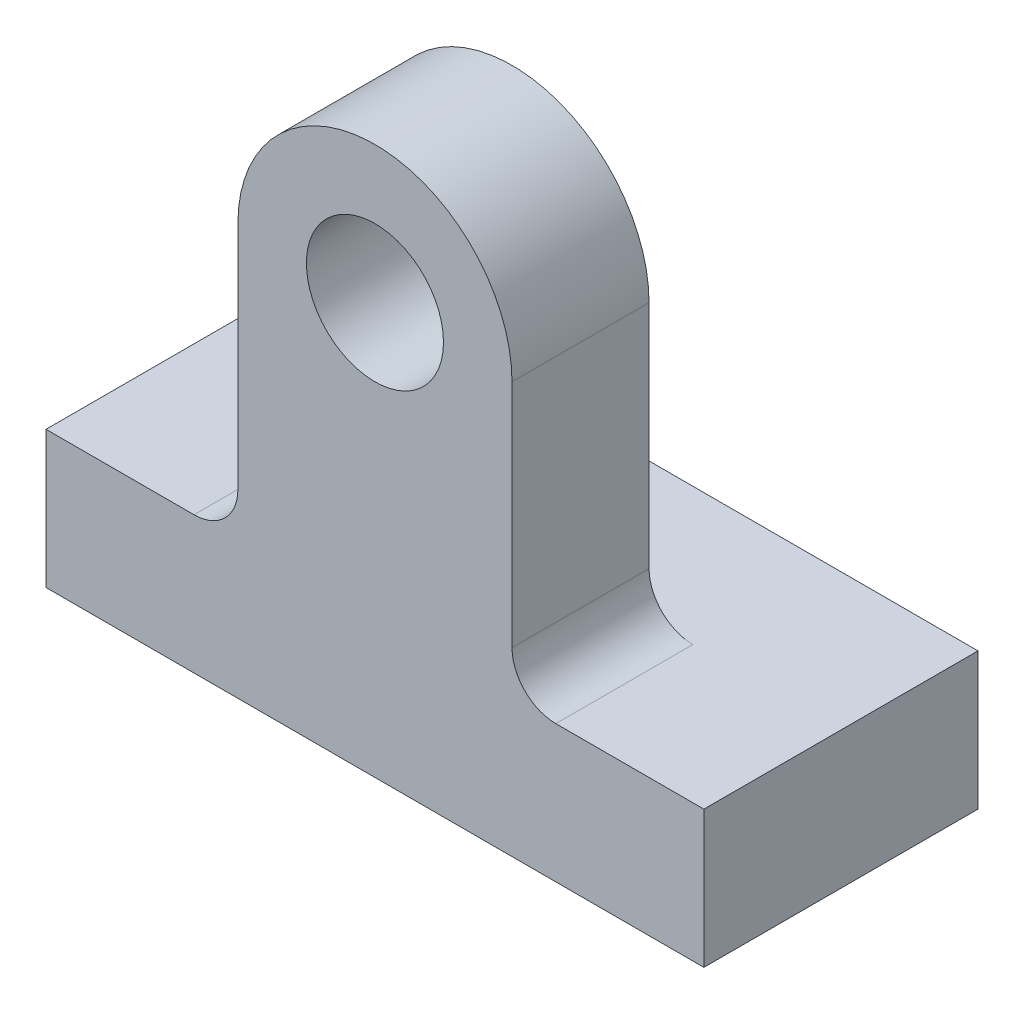
ISO-10303-21;
HEADER;
FILE_DESCRIPTION(('STEP AP214'),'2;1');
FILE_NAME('part.step','',(''),(''),'','','');
FILE_SCHEMA(('AUTOMOTIVE_DESIGN { 1 0 10303 214 1 1 1 1 }'));
ENDSEC;
DATA;
#1=APPLICATION_CONTEXT('core data for automotive mechanical design processes');
#2=APPLICATION_PROTOCOL_DEFINITION('international standard','automotive_design',2000,#1);
#3=PRODUCT_CONTEXT('',#1,'mechanical');
#4=PRODUCT('Part','Part','',(#3));
#5=PRODUCT_RELATED_PRODUCT_CATEGORY('part','',(#4));
#6=PRODUCT_DEFINITION_FORMATION('','',#4);
#7=PRODUCT_DEFINITION_CONTEXT('part definition',#1,'design');
#8=PRODUCT_DEFINITION('design','',#6,#7);
#9=PRODUCT_DEFINITION_SHAPE('','',#8);
#10=(LENGTH_UNIT() NAMED_UNIT(*) SI_UNIT(.MILLI.,.METRE.));
#11=(NAMED_UNIT(*) PLANE_ANGLE_UNIT() SI_UNIT($,.RADIAN.));
#12=(NAMED_UNIT(*) SI_UNIT($,.STERADIAN.) SOLID_ANGLE_UNIT());
#13=UNCERTAINTY_MEASURE_WITH_UNIT(LENGTH_MEASURE(1.E-05),#10,'distance_accuracy_value','');
#14=(GEOMETRIC_REPRESENTATION_CONTEXT(3) GLOBAL_UNCERTAINTY_ASSIGNED_CONTEXT((#13)) GLOBAL_UNIT_ASSIGNED_CONTEXT((#10,
#11,#12)) REPRESENTATION_CONTEXT('',''));
#15=CARTESIAN_POINT('',(0.,0.,0.));
#16=DIRECTION('',(0.,0.,1.));
#17=DIRECTION('',(1.,0.,0.));
#18=AXIS2_PLACEMENT_3D('',#15,#16,#17);
#19=CARTESIAN_POINT('',(0.,635.,0.));
#20=DIRECTION('',(1.,0.,0.));
#21=DIRECTION('',(0.,0.,-1.));
#22=AXIS2_PLACEMENT_3D('',#19,#20,#21);
#23=PLANE('',#22);
#24=DIRECTION('',(0.,0.,1.));
#25=VECTOR('',#24,1.);
#26=CARTESIAN_POINT('',(0.,0.,0.));
#27=LINE('',#26,#25);
#28=CARTESIAN_POINT('',(0.,0.,0.));
#29=VERTEX_POINT('',#28);
#30=CARTESIAN_POINT('',(0.,0.,1270.));
#31=VERTEX_POINT('',#30);
#32=EDGE_CURVE('E149',#29,#31,#27,.T.);
#33=ORIENTED_EDGE('',*,*,#32,.T.);
#34=DIRECTION('',(0.,-1.,0.));
#35=VECTOR('',#34,1.);
#36=CARTESIAN_POINT('',(0.,635.,1270.));
#37=LINE('',#36,#35);
#38=CARTESIAN_POINT('',(0.,635.,1270.));
#39=VERTEX_POINT('',#38);
#40=EDGE_CURVE('E183',#39,#31,#37,.T.);
#41=ORIENTED_EDGE('',*,*,#40,.F.);
#42=DIRECTION('',(0.,0.,1.));
#43=VECTOR('',#42,1.);
#44=CARTESIAN_POINT('',(0.,635.,0.));
#45=LINE('',#44,#43);
#46=CARTESIAN_POINT('',(0.,635.,0.));
#47=VERTEX_POINT('',#46);
#48=EDGE_CURVE('E158',#47,#39,#45,.T.);
#49=ORIENTED_EDGE('',*,*,#48,.F.);
#50=DIRECTION('',(0.,-1.,0.));
#51=VECTOR('',#50,1.);
#52=CARTESIAN_POINT('',(0.,635.,0.));
#53=LINE('',#52,#51);
#54=EDGE_CURVE('E169',#47,#29,#53,.T.);
#55=ORIENTED_EDGE('',*,*,#54,.T.);
#56=EDGE_LOOP('',(#33,#41,#49,#55));
#57=FACE_BOUND('',#56,.T.);
#58=ADVANCED_FACE('F53',(#57),#23,.F.);
#59=CARTESIAN_POINT('',(0.,635.,1270.));
#60=DIRECTION('',(0.,0.,-1.));
#61=DIRECTION('',(-1.,0.,0.));
#62=AXIS2_PLACEMENT_3D('',#59,#60,#61);
#63=PLANE('',#62);
#64=DIRECTION('',(1.,0.,0.));
#65=VECTOR('',#64,1.);
#66=CARTESIAN_POINT('',(0.,0.,1270.));
#67=LINE('',#66,#65);
#68=CARTESIAN_POINT('',(3048.,0.,1270.));
#69=VERTEX_POINT('',#68);
#70=EDGE_CURVE('E152',#31,#69,#67,.T.);
#71=ORIENTED_EDGE('',*,*,#70,.T.);
#72=DIRECTION('',(0.,-1.,0.));
#73=VECTOR('',#72,1.);
#74=CARTESIAN_POINT('',(3048.,635.,1270.));
#75=LINE('',#74,#73);
#76=CARTESIAN_POINT('',(3048.,635.,1270.));
#77=VERTEX_POINT('',#76);
#78=EDGE_CURVE('E180',#77,#69,#75,.T.);
#79=ORIENTED_EDGE('',*,*,#78,.F.);
#80=DIRECTION('',(1.,0.,0.));
#81=VECTOR('',#80,1.);
#82=CARTESIAN_POINT('',(0.,635.,1270.));
#83=LINE('',#82,#81);
#84=CARTESIAN_POINT('',(2362.2,635.,1270.));
#85=VERTEX_POINT('',#84);
#86=EDGE_CURVE('E161',#85,#77,#83,.T.);
#87=ORIENTED_EDGE('',*,*,#86,.F.);
#88=CARTESIAN_POINT('',(2362.2,838.2,1270.));
#89=DIRECTION('',(0.,0.,-1.));
#90=DIRECTION('',(-1.,0.,0.));
#91=AXIS2_PLACEMENT_3D('',#88,#89,#90);
#92=CIRCLE('',#91,203.2);
#93=CARTESIAN_POINT('',(2159.,838.2,1270.));
#94=VERTEX_POINT('',#93);
#95=EDGE_CURVE('E196',#85,#94,#92,.T.);
#96=ORIENTED_EDGE('',*,*,#95,.T.);
#97=DIRECTION('',(0.,1.,0.));
#98=VECTOR('',#97,1.);
#99=CARTESIAN_POINT('',(2159.,635.,1270.));
#100=LINE('',#99,#98);
#101=CARTESIAN_POINT('',(2159.,1905.,1270.));
#102=VERTEX_POINT('',#101);
#103=EDGE_CURVE('E134',#94,#102,#100,.T.);
#104=ORIENTED_EDGE('',*,*,#103,.T.);
#105=CARTESIAN_POINT('',(1524.,1905.,1270.));
#106=DIRECTION('',(0.,0.,-1.));
#107=DIRECTION('',(-1.,0.,0.));
#108=AXIS2_PLACEMENT_3D('',#105,#106,#107);
#109=CIRCLE('',#108,635.);
#110=CARTESIAN_POINT('',(889.,1905.,1270.));
#111=VERTEX_POINT('',#110);
#112=EDGE_CURVE('E264',#111,#102,#109,.T.);
#113=ORIENTED_EDGE('',*,*,#112,.F.);
#114=DIRECTION('',(0.,1.,0.));
#115=VECTOR('',#114,1.);
#116=CARTESIAN_POINT('',(889.,635.,1270.));
#117=LINE('',#116,#115);
#118=CARTESIAN_POINT('',(889.,838.2,1270.));
#119=VERTEX_POINT('',#118);
#120=EDGE_CURVE('E147',#119,#111,#117,.T.);
#121=ORIENTED_EDGE('',*,*,#120,.F.);
#122=CARTESIAN_POINT('',(685.8,838.2,1270.));
#123=DIRECTION('',(0.,0.,-1.));
#124=DIRECTION('',(-1.,0.,0.));
#125=AXIS2_PLACEMENT_3D('',#122,#123,#124);
#126=CIRCLE('',#125,203.2);
#127=CARTESIAN_POINT('',(685.8,635.,1270.));
#128=VERTEX_POINT('',#127);
#129=EDGE_CURVE('E61',#119,#128,#126,.T.);
#130=ORIENTED_EDGE('',*,*,#129,.T.);
#131=EDGE_CURVE('E163',#39,#128,#83,.T.);
#132=ORIENTED_EDGE('',*,*,#131,.F.);
#133=ORIENTED_EDGE('',*,*,#40,.T.);
#134=EDGE_LOOP('',(#71,#79,#87,#96,#104,#113,#121,#130,#132,#133));
#135=FACE_BOUND('',#134,.T.);
#136=CARTESIAN_POINT('',(1524.,1905.,1270.));
#137=DIRECTION('',(0.,0.,1.));
#138=DIRECTION('',(1.,0.,0.));
#139=AXIS2_PLACEMENT_3D('',#136,#137,#138);
#140=CIRCLE('',#139,317.5);
#141=CARTESIAN_POINT('',(1841.5,1905.,1270.));
#142=VERTEX_POINT('',#141);
#143=EDGE_CURVE('E257',#142,#142,#140,.T.);
#144=ORIENTED_EDGE('',*,*,#143,.F.);
#145=EDGE_LOOP('',(#144));
#146=FACE_BOUND('',#145,.T.);
#147=ADVANCED_FACE('F201',(#135,#146),#63,.F.);
#148=CARTESIAN_POINT('',(3048.,635.,0.));
#149=DIRECTION('',(-1.,0.,0.));
#150=DIRECTION('',(0.,0.,1.));
#151=AXIS2_PLACEMENT_3D('',#148,#149,#150);
#152=PLANE('',#151);
#153=DIRECTION('',(0.,0.,-1.));
#154=VECTOR('',#153,1.);
#155=CARTESIAN_POINT('',(3048.,0.,0.));
#156=LINE('',#155,#154);
#157=CARTESIAN_POINT('',(3048.,0.,0.));
#158=VERTEX_POINT('',#157);
#159=EDGE_CURVE('E172',#69,#158,#156,.T.);
#160=ORIENTED_EDGE('',*,*,#159,.T.);
#161=DIRECTION('',(0.,-1.,0.));
#162=VECTOR('',#161,1.);
#163=CARTESIAN_POINT('',(3048.,635.,0.));
#164=LINE('',#163,#162);
#165=CARTESIAN_POINT('',(3048.,635.,0.));
#166=VERTEX_POINT('',#165);
#167=EDGE_CURVE('E177',#166,#158,#164,.T.);
#168=ORIENTED_EDGE('',*,*,#167,.F.);
#169=DIRECTION('',(0.,0.,-1.));
#170=VECTOR('',#169,1.);
#171=CARTESIAN_POINT('',(3048.,635.,0.));
#172=LINE('',#171,#170);
#173=EDGE_CURVE('E166',#77,#166,#172,.T.);
#174=ORIENTED_EDGE('',*,*,#173,.F.);
#175=ORIENTED_EDGE('',*,*,#78,.T.);
#176=EDGE_LOOP('',(#160,#168,#174,#175));
#177=FACE_BOUND('',#176,.T.);
#178=ADVANCED_FACE('F220',(#177),#152,.F.);
#179=CARTESIAN_POINT('',(0.,635.,0.));
#180=DIRECTION('',(0.,0.,1.));
#181=DIRECTION('',(1.,0.,0.));
#182=AXIS2_PLACEMENT_3D('',#179,#180,#181);
#183=PLANE('',#182);
#184=DIRECTION('',(-1.,0.,0.));
#185=VECTOR('',#184,1.);
#186=CARTESIAN_POINT('',(0.,0.,0.));
#187=LINE('',#186,#185);
#188=EDGE_CURVE('E162',#158,#29,#187,.T.);
#189=ORIENTED_EDGE('',*,*,#188,.T.);
#190=ORIENTED_EDGE('',*,*,#54,.F.);
#191=DIRECTION('',(-1.,0.,0.));
#192=VECTOR('',#191,1.);
#193=CARTESIAN_POINT('',(0.,635.,0.));
#194=LINE('',#193,#192);
#195=EDGE_CURVE('E168',#166,#47,#194,.T.);
#196=ORIENTED_EDGE('',*,*,#195,.F.);
#197=ORIENTED_EDGE('',*,*,#167,.T.);
#198=EDGE_LOOP('',(#189,#190,#196,#197));
#199=FACE_BOUND('',#198,.T.);
#200=ADVANCED_FACE('F225',(#199),#183,.F.);
#201=CARTESIAN_POINT('',(0.,635.,0.));
#202=DIRECTION('',(0.,1.,0.));
#203=DIRECTION('',(0.,0.,1.));
#204=AXIS2_PLACEMENT_3D('',#201,#202,#203);
#205=PLANE('',#204);
#206=DIRECTION('',(1.,0.,0.));
#207=VECTOR('',#206,1.);
#208=CARTESIAN_POINT('',(889.,635.,635.));
#209=LINE('',#208,#207);
#210=CARTESIAN_POINT('',(685.8,635.,635.));
#211=VERTEX_POINT('',#210);
#212=CARTESIAN_POINT('',(2362.2,635.,635.));
#213=VERTEX_POINT('',#212);
#214=EDGE_CURVE('E154',#211,#213,#209,.T.);
#215=ORIENTED_EDGE('',*,*,#214,.T.);
#216=DIRECTION('',(0.,0.,1.));
#217=VECTOR('',#216,1.);
#218=CARTESIAN_POINT('',(2362.2,635.,1270.));
#219=LINE('',#218,#217);
#220=EDGE_CURVE('E189',#213,#85,#219,.T.);
#221=ORIENTED_EDGE('',*,*,#220,.T.);
#222=ORIENTED_EDGE('',*,*,#86,.T.);
#223=ORIENTED_EDGE('',*,*,#173,.T.);
#224=ORIENTED_EDGE('',*,*,#195,.T.);
#225=ORIENTED_EDGE('',*,*,#48,.T.);
#226=ORIENTED_EDGE('',*,*,#131,.T.);
#227=DIRECTION('',(0.,0.,1.));
#228=VECTOR('',#227,1.);
#229=CARTESIAN_POINT('',(685.8,635.,0.));
#230=LINE('',#229,#228);
#231=EDGE_CURVE('E186',#128,#211,#230,.F.);
#232=ORIENTED_EDGE('',*,*,#231,.T.);
#233=EDGE_LOOP('',(#215,#221,#222,#223,#224,#225,#226,#232));
#234=FACE_BOUND('',#233,.T.);
#235=ADVANCED_FACE('F204',(#234),#205,.T.);
#236=CARTESIAN_POINT('',(0.,0.,0.));
#237=DIRECTION('',(0.,1.,0.));
#238=DIRECTION('',(0.,0.,1.));
#239=AXIS2_PLACEMENT_3D('',#236,#237,#238);
#240=PLANE('',#239);
#241=ORIENTED_EDGE('',*,*,#32,.F.);
#242=ORIENTED_EDGE('',*,*,#188,.F.);
#243=ORIENTED_EDGE('',*,*,#159,.F.);
#244=ORIENTED_EDGE('',*,*,#70,.F.);
#245=EDGE_LOOP('',(#241,#242,#243,#244));
#246=FACE_BOUND('',#245,.T.);
#247=ADVANCED_FACE('F230',(#246),#240,.F.);
#248=CARTESIAN_POINT('',(889.,635.,635.));
#249=DIRECTION('',(1.,0.,0.));
#250=DIRECTION('',(0.,0.,-1.));
#251=AXIS2_PLACEMENT_3D('',#248,#249,#250);
#252=PLANE('',#251);
#253=DIRECTION('',(0.,1.,0.));
#254=VECTOR('',#253,1.);
#255=CARTESIAN_POINT('',(889.,635.,635.));
#256=LINE('',#255,#254);
#257=CARTESIAN_POINT('',(889.,838.2,635.));
#258=VERTEX_POINT('',#257);
#259=CARTESIAN_POINT('',(889.,1905.,635.));
#260=VERTEX_POINT('',#259);
#261=EDGE_CURVE('E126',#258,#260,#256,.T.);
#262=ORIENTED_EDGE('',*,*,#261,.F.);
#263=DIRECTION('',(0.,0.,1.));
#264=VECTOR('',#263,1.);
#265=CARTESIAN_POINT('',(889.,838.2,635.));
#266=LINE('',#265,#264);
#267=EDGE_CURVE('E194',#258,#119,#266,.T.);
#268=ORIENTED_EDGE('',*,*,#267,.T.);
#269=ORIENTED_EDGE('',*,*,#120,.T.);
#270=DIRECTION('',(0.,0.,1.));
#271=VECTOR('',#270,1.);
#272=CARTESIAN_POINT('',(889.,1905.,635.));
#273=LINE('',#272,#271);
#274=EDGE_CURVE('E140',#260,#111,#273,.T.);
#275=ORIENTED_EDGE('',*,*,#274,.F.);
#276=EDGE_LOOP('',(#262,#268,#269,#275));
#277=FACE_BOUND('',#276,.T.);
#278=ADVANCED_FACE('F145',(#277),#252,.F.);
#279=CARTESIAN_POINT('',(1524.,1905.,635.));
#280=DIRECTION('',(0.,0.,1.));
#281=DIRECTION('',(1.,0.,0.));
#282=AXIS2_PLACEMENT_3D('',#279,#280,#281);
#283=CYLINDRICAL_SURFACE('',#282,635.);
#284=ORIENTED_EDGE('',*,*,#112,.T.);
#285=DIRECTION('',(0.,0.,1.));
#286=VECTOR('',#285,1.);
#287=CARTESIAN_POINT('',(2159.,1905.,635.));
#288=LINE('',#287,#286);
#289=CARTESIAN_POINT('',(2159.,1905.,635.));
#290=VERTEX_POINT('',#289);
#291=EDGE_CURVE('E142',#290,#102,#288,.T.);
#292=ORIENTED_EDGE('',*,*,#291,.F.);
#293=CARTESIAN_POINT('',(1524.,1905.,635.));
#294=DIRECTION('',(0.,0.,-1.));
#295=DIRECTION('',(-1.,0.,0.));
#296=AXIS2_PLACEMENT_3D('',#293,#294,#295);
#297=CIRCLE('',#296,635.);
#298=EDGE_CURVE('E130',#260,#290,#297,.T.);
#299=ORIENTED_EDGE('',*,*,#298,.F.);
#300=ORIENTED_EDGE('',*,*,#274,.T.);
#301=EDGE_LOOP('',(#284,#292,#299,#300));
#302=FACE_BOUND('',#301,.T.);
#303=ADVANCED_FACE('F139',(#302),#283,.T.);
#304=CARTESIAN_POINT('',(2159.,635.,635.));
#305=DIRECTION('',(1.,0.,0.));
#306=DIRECTION('',(0.,1.,0.));
#307=AXIS2_PLACEMENT_3D('',#304,#305,#306);
#308=PLANE('',#307);
#309=ORIENTED_EDGE('',*,*,#103,.F.);
#310=DIRECTION('',(0.,0.,1.));
#311=VECTOR('',#310,1.);
#312=CARTESIAN_POINT('',(2159.,838.2,635.));
#313=LINE('',#312,#311);
#314=CARTESIAN_POINT('',(2159.,838.2,635.));
#315=VERTEX_POINT('',#314);
#316=EDGE_CURVE('E192',#94,#315,#313,.F.);
#317=ORIENTED_EDGE('',*,*,#316,.T.);
#318=DIRECTION('',(0.,1.,0.));
#319=VECTOR('',#318,1.);
#320=CARTESIAN_POINT('',(2159.,635.,635.));
#321=LINE('',#320,#319);
#322=EDGE_CURVE('E143',#315,#290,#321,.T.);
#323=ORIENTED_EDGE('',*,*,#322,.T.);
#324=ORIENTED_EDGE('',*,*,#291,.T.);
#325=EDGE_LOOP('',(#309,#317,#323,#324));
#326=FACE_BOUND('',#325,.T.);
#327=ADVANCED_FACE('F240',(#326),#308,.T.);
#328=CARTESIAN_POINT('',(1524.,1905.,635.));
#329=DIRECTION('',(0.,0.,-1.));
#330=DIRECTION('',(-1.,0.,0.));
#331=AXIS2_PLACEMENT_3D('',#328,#329,#330);
#332=PLANE('',#331);
#333=CARTESIAN_POINT('',(1524.,1905.,635.));
#334=DIRECTION('',(0.,0.,1.));
#335=DIRECTION('',(1.,0.,0.));
#336=AXIS2_PLACEMENT_3D('',#333,#334,#335);
#337=CIRCLE('',#336,317.5);
#338=CARTESIAN_POINT('',(1841.5,1905.,635.));
#339=VERTEX_POINT('',#338);
#340=EDGE_CURVE('E254',#339,#339,#337,.T.);
#341=ORIENTED_EDGE('',*,*,#340,.T.);
#342=EDGE_LOOP('',(#341));
#343=FACE_BOUND('',#342,.T.);
#344=ORIENTED_EDGE('',*,*,#214,.F.);
#345=CARTESIAN_POINT('',(685.8,838.2,635.));
#346=DIRECTION('',(0.,0.,-1.));
#347=DIRECTION('',(-1.,0.,0.));
#348=AXIS2_PLACEMENT_3D('',#345,#346,#347);
#349=CIRCLE('',#348,203.2);
#350=EDGE_CURVE('E12',#211,#258,#349,.F.);
#351=ORIENTED_EDGE('',*,*,#350,.T.);
#352=ORIENTED_EDGE('',*,*,#261,.T.);
#353=ORIENTED_EDGE('',*,*,#298,.T.);
#354=ORIENTED_EDGE('',*,*,#322,.F.);
#355=CARTESIAN_POINT('',(2362.2,838.2,635.));
#356=DIRECTION('',(0.,0.,-1.));
#357=DIRECTION('',(-1.,0.,0.));
#358=AXIS2_PLACEMENT_3D('',#355,#356,#357);
#359=CIRCLE('',#358,203.2);
#360=EDGE_CURVE('E198',#315,#213,#359,.F.);
#361=ORIENTED_EDGE('',*,*,#360,.T.);
#362=EDGE_LOOP('',(#344,#351,#352,#353,#354,#361));
#363=FACE_BOUND('',#362,.T.);
#364=ADVANCED_FACE('F128',(#343,#363),#332,.T.);
#365=CARTESIAN_POINT('',(1524.,1905.,635.));
#366=DIRECTION('',(0.,0.,1.));
#367=DIRECTION('',(1.,0.,0.));
#368=AXIS2_PLACEMENT_3D('',#365,#366,#367);
#369=CYLINDRICAL_SURFACE('',#368,317.5);
#370=CARTESIAN_POINT('',(1841.5,1905.,635.));
#371=CARTESIAN_POINT('',(1841.5,1905.,641.614583333333));
#372=CARTESIAN_POINT('',(1841.5,1905.,648.229166666667));
#373=CARTESIAN_POINT('',(1841.5,1905.,661.458333333333));
#374=CARTESIAN_POINT('',(1841.5,1905.,668.072916666667));
#375=CARTESIAN_POINT('',(1841.5,1905.,681.302083333333));
#376=CARTESIAN_POINT('',(1841.5,1905.,687.916666666667));
#377=CARTESIAN_POINT('',(1841.5,1905.,701.145833333333));
#378=CARTESIAN_POINT('',(1841.5,1905.,707.760416666667));
#379=CARTESIAN_POINT('',(1841.5,1905.,720.989583333333));
#380=CARTESIAN_POINT('',(1841.5,1905.,727.604166666667));
#381=CARTESIAN_POINT('',(1841.5,1905.,740.833333333333));
#382=CARTESIAN_POINT('',(1841.5,1905.,747.447916666667));
#383=CARTESIAN_POINT('',(1841.5,1905.,760.677083333333));
#384=CARTESIAN_POINT('',(1841.5,1905.,767.291666666667));
#385=CARTESIAN_POINT('',(1841.5,1905.,780.520833333333));
#386=CARTESIAN_POINT('',(1841.5,1905.,787.135416666667));
#387=CARTESIAN_POINT('',(1841.5,1905.,800.364583333333));
#388=CARTESIAN_POINT('',(1841.5,1905.,806.979166666667));
#389=CARTESIAN_POINT('',(1841.5,1905.,820.208333333333));
#390=CARTESIAN_POINT('',(1841.5,1905.,826.822916666667));
#391=CARTESIAN_POINT('',(1841.5,1905.,840.052083333333));
#392=CARTESIAN_POINT('',(1841.5,1905.,846.666666666667));
#393=CARTESIAN_POINT('',(1841.5,1905.,859.895833333333));
#394=CARTESIAN_POINT('',(1841.5,1905.,866.510416666667));
#395=CARTESIAN_POINT('',(1841.5,1905.,879.739583333333));
#396=CARTESIAN_POINT('',(1841.5,1905.,886.354166666667));
#397=CARTESIAN_POINT('',(1841.5,1905.,899.583333333333));
#398=CARTESIAN_POINT('',(1841.5,1905.,906.197916666667));
#399=CARTESIAN_POINT('',(1841.5,1905.,919.427083333333));
#400=CARTESIAN_POINT('',(1841.5,1905.,926.041666666667));
#401=CARTESIAN_POINT('',(1841.5,1905.,939.270833333333));
#402=CARTESIAN_POINT('',(1841.5,1905.,945.885416666667));
#403=CARTESIAN_POINT('',(1841.5,1905.,959.114583333333));
#404=CARTESIAN_POINT('',(1841.5,1905.,965.729166666667));
#405=CARTESIAN_POINT('',(1841.5,1905.,978.958333333333));
#406=CARTESIAN_POINT('',(1841.5,1905.,985.572916666667));
#407=CARTESIAN_POINT('',(1841.5,1905.,998.802083333333));
#408=CARTESIAN_POINT('',(1841.5,1905.,1005.41666666667));
#409=CARTESIAN_POINT('',(1841.5,1905.,1018.64583333333));
#410=CARTESIAN_POINT('',(1841.5,1905.,1025.26041666667));
#411=CARTESIAN_POINT('',(1841.5,1905.,1038.48958333333));
#412=CARTESIAN_POINT('',(1841.5,1905.,1045.10416666667));
#413=CARTESIAN_POINT('',(1841.5,1905.,1058.33333333333));
#414=CARTESIAN_POINT('',(1841.5,1905.,1064.94791666667));
#415=CARTESIAN_POINT('',(1841.5,1905.,1078.17708333333));
#416=CARTESIAN_POINT('',(1841.5,1905.,1084.79166666667));
#417=CARTESIAN_POINT('',(1841.5,1905.,1098.02083333333));
#418=CARTESIAN_POINT('',(1841.5,1905.,1104.63541666667));
#419=CARTESIAN_POINT('',(1841.5,1905.,1117.86458333333));
#420=CARTESIAN_POINT('',(1841.5,1905.,1124.47916666667));
#421=CARTESIAN_POINT('',(1841.5,1905.,1137.70833333333));
#422=CARTESIAN_POINT('',(1841.5,1905.,1144.32291666667));
#423=CARTESIAN_POINT('',(1841.5,1905.,1157.55208333333));
#424=CARTESIAN_POINT('',(1841.5,1905.,1164.16666666667));
#425=CARTESIAN_POINT('',(1841.5,1905.,1177.39583333333));
#426=CARTESIAN_POINT('',(1841.5,1905.,1184.01041666667));
#427=CARTESIAN_POINT('',(1841.5,1905.,1197.23958333333));
#428=CARTESIAN_POINT('',(1841.5,1905.,1203.85416666667));
#429=CARTESIAN_POINT('',(1841.5,1905.,1217.08333333333));
#430=CARTESIAN_POINT('',(1841.5,1905.,1223.69791666667));
#431=CARTESIAN_POINT('',(1841.5,1905.,1236.92708333333));
#432=CARTESIAN_POINT('',(1841.5,1905.,1243.54166666667));
#433=CARTESIAN_POINT('',(1841.5,1905.,1256.77083333333));
#434=CARTESIAN_POINT('',(1841.5,1905.,1263.38541666667));
#435=CARTESIAN_POINT('',(1841.5,1905.,1270.));
#436=B_SPLINE_CURVE_WITH_KNOTS('',3,(#370,#371,#372,#373,#374,#375,#376,#377,#378,#379,#380,
#381,#382,#383,#384,#385,#386,#387,#388,#389,#390,#391,#392,#393,#394,#395,#396,#397,#398,#399,
#400,#401,#402,#403,#404,#405,#406,#407,#408,#409,#410,#411,#412,#413,#414,#415,#416,#417,#418,
#419,#420,#421,#422,#423,#424,#425,#426,#427,#428,#429,#430,#431,#432,#433,#434,#435),
.UNSPECIFIED.,.F.,.F.,(4,2,2,2,2,2,2,2,2,2,2,2,2,2,2,2,2,2,2,2,2,2,2,2,2,2,2,2,2,2,2,2,4),(0.,
19.84375,39.6875000000001,59.53125,79.3750000000001,99.21875,119.0625,138.90625,158.75,
178.59375,198.4375,218.28125,238.125,257.96875,277.8125,297.65625,317.5,337.34375,357.1875,
377.03125,396.875,416.71875,436.5625,456.40625,476.25,496.09375,515.9375,535.78125,555.625,
575.46875,595.3125,615.15625,635.),.UNSPECIFIED.);
#437=EDGE_CURVE('BSEAM212',#339,#142,#436,.T.);
#438=ORIENTED_EDGE('',*,*,#340,.F.);
#439=ORIENTED_EDGE('',*,*,#143,.T.);
#440=ORIENTED_EDGE('',*,*,#437,.T.);
#441=ORIENTED_EDGE('',*,*,#437,.F.);
#442=EDGE_LOOP('',(#438,#440,#439,#441));
#443=FACE_BOUND('',#442,.T.);
#444=ADVANCED_FACE('F212',(#443),#369,.F.);
#445=CARTESIAN_POINT('',(2362.2,838.2,0.));
#446=DIRECTION('',(0.,0.,-1.));
#447=DIRECTION('',(-1.,0.,0.));
#448=AXIS2_PLACEMENT_3D('',#445,#446,#447);
#449=CYLINDRICAL_SURFACE('',#448,203.2);
#450=ORIENTED_EDGE('',*,*,#360,.F.);
#451=ORIENTED_EDGE('',*,*,#316,.F.);
#452=ORIENTED_EDGE('',*,*,#95,.F.);
#453=ORIENTED_EDGE('',*,*,#220,.F.);
#454=EDGE_LOOP('',(#450,#451,#452,#453));
#455=FACE_BOUND('',#454,.T.);
#456=ADVANCED_FACE('F208',(#455),#449,.F.);
#457=CARTESIAN_POINT('',(685.8,838.2,635.));
#458=DIRECTION('',(0.,0.,1.));
#459=DIRECTION('',(1.,0.,0.));
#460=AXIS2_PLACEMENT_3D('',#457,#458,#459);
#461=CYLINDRICAL_SURFACE('',#460,203.2);
#462=ORIENTED_EDGE('',*,*,#350,.F.);
#463=ORIENTED_EDGE('',*,*,#231,.F.);
#464=ORIENTED_EDGE('',*,*,#129,.F.);
#465=ORIENTED_EDGE('',*,*,#267,.F.);
#466=EDGE_LOOP('',(#462,#463,#464,#465));
#467=FACE_BOUND('',#466,.T.);
#468=ADVANCED_FACE('F55',(#467),#461,.F.);
#469=CLOSED_SHELL('',(#58,#147,#178,#200,#235,#247,#278,#303,#327,#364,#444,#456,#468));
#470=MANIFOLD_SOLID_BREP('B2',#469);
#471=ADVANCED_BREP_SHAPE_REPRESENTATION('',(#18,#470),#14);
#472=SHAPE_DEFINITION_REPRESENTATION(#9,#471);
ENDSEC;
END-ISO-10303-21;
